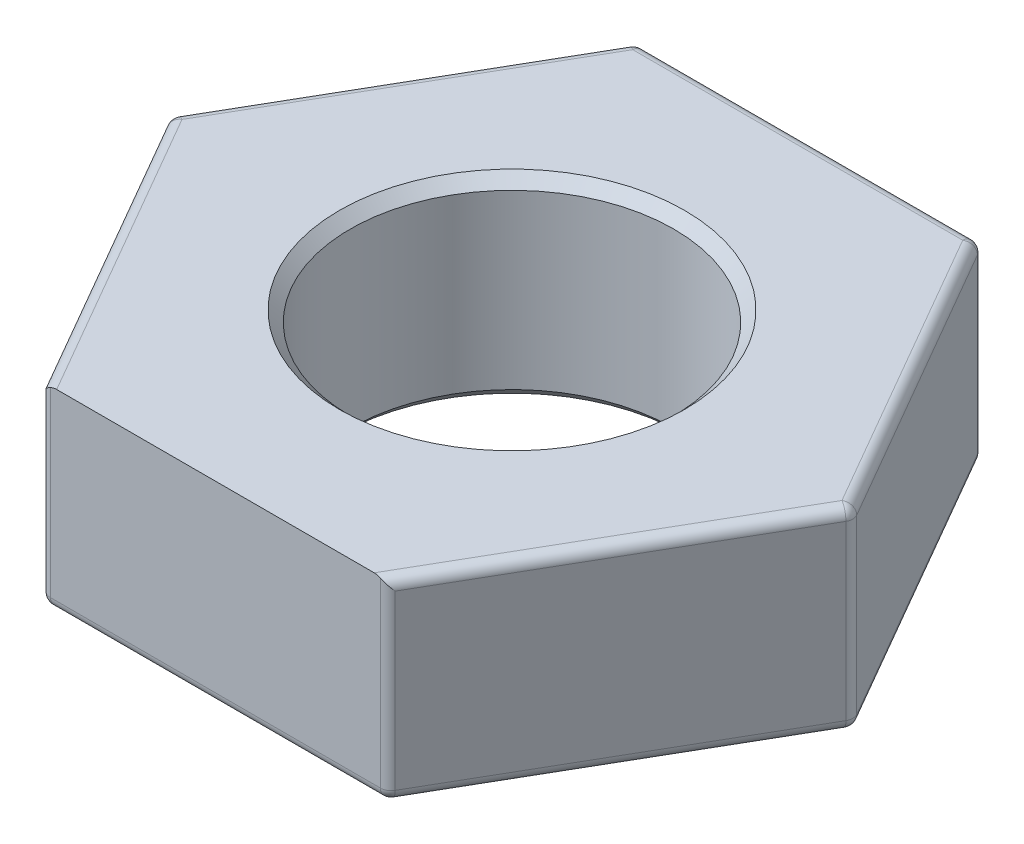
ISO-10303-21;
HEADER;
FILE_DESCRIPTION(('STEP AP214'),'2;1');
FILE_NAME('part.step','',(''),(''),'','','');
FILE_SCHEMA(('AUTOMOTIVE_DESIGN { 1 0 10303 214 1 1 1 1 }'));
ENDSEC;
DATA;
#1=APPLICATION_CONTEXT('core data for automotive mechanical design processes');
#2=APPLICATION_PROTOCOL_DEFINITION('international standard','automotive_design',2000,#1);
#3=PRODUCT_CONTEXT('',#1,'mechanical');
#4=PRODUCT('Part','Part','',(#3));
#5=PRODUCT_RELATED_PRODUCT_CATEGORY('part','',(#4));
#6=PRODUCT_DEFINITION_FORMATION('','',#4);
#7=PRODUCT_DEFINITION_CONTEXT('part definition',#1,'design');
#8=PRODUCT_DEFINITION('design','',#6,#7);
#9=PRODUCT_DEFINITION_SHAPE('','',#8);
#10=(LENGTH_UNIT() NAMED_UNIT(*) SI_UNIT(.MILLI.,.METRE.));
#11=(NAMED_UNIT(*) PLANE_ANGLE_UNIT() SI_UNIT($,.RADIAN.));
#12=(NAMED_UNIT(*) SI_UNIT($,.STERADIAN.) SOLID_ANGLE_UNIT());
#13=UNCERTAINTY_MEASURE_WITH_UNIT(LENGTH_MEASURE(1.E-05),#10,'distance_accuracy_value','');
#14=(GEOMETRIC_REPRESENTATION_CONTEXT(3) GLOBAL_UNCERTAINTY_ASSIGNED_CONTEXT((#13)) GLOBAL_UNIT_ASSIGNED_CONTEXT((#10,
#11,#12)) REPRESENTATION_CONTEXT('',''));
#15=CARTESIAN_POINT('',(0.,0.,0.));
#16=DIRECTION('',(0.,0.,1.));
#17=DIRECTION('',(1.,0.,0.));
#18=AXIS2_PLACEMENT_3D('',#15,#16,#17);
#19=CARTESIAN_POINT('',(-2.38156986040721,1.8,-1.375));
#20=DIRECTION('',(-0.866025403784438,0.,-0.5));
#21=DIRECTION('',(-0.5,0.,0.866025403784439));
#22=AXIS2_PLACEMENT_3D('',#19,#20,#21);
#23=PLANE('',#22);
#24=DIRECTION('',(0.,-1.,0.));
#25=VECTOR('',#24,1.);
#26=CARTESIAN_POINT('',(-1.61658075373095,1.8,-2.7));
#27=LINE('',#26,#25);
#28=CARTESIAN_POINT('',(-1.61658075373095,1.7,-2.7));
#29=VERTEX_POINT('',#28);
#30=CARTESIAN_POINT('',(-1.61658075373095,0.1,-2.7));
#31=VERTEX_POINT('',#30);
#32=EDGE_CURVE('E414',#29,#31,#27,.T.);
#33=ORIENTED_EDGE('',*,*,#32,.T.);
#34=DIRECTION('',(0.5,0.,-0.866025403784439));
#35=VECTOR('',#34,1.);
#36=CARTESIAN_POINT('',(-3.17542648054294,0.1,0.));
#37=LINE('',#36,#35);
#38=CARTESIAN_POINT('',(-3.14655896708346,0.1,-0.0500000000000005));
#39=VERTEX_POINT('',#38);
#40=EDGE_CURVE('E420',#31,#39,#37,.F.);
#41=ORIENTED_EDGE('',*,*,#40,.T.);
#42=DIRECTION('',(0.,-1.,0.));
#43=VECTOR('',#42,1.);
#44=CARTESIAN_POINT('',(-3.14655896708346,1.8,-0.0500000000000003));
#45=LINE('',#44,#43);
#46=CARTESIAN_POINT('',(-3.14655896708346,1.7,-0.0500000000000005));
#47=VERTEX_POINT('',#46);
#48=EDGE_CURVE('E417',#39,#47,#45,.F.);
#49=ORIENTED_EDGE('',*,*,#48,.T.);
#50=DIRECTION('',(0.5,0.,-0.866025403784439));
#51=VECTOR('',#50,1.);
#52=CARTESIAN_POINT('',(-2.38156986040721,1.7,-1.375));
#53=LINE('',#52,#51);
#54=EDGE_CURVE('E411',#47,#29,#53,.T.);
#55=ORIENTED_EDGE('',*,*,#54,.T.);
#56=EDGE_LOOP('',(#33,#41,#49,#55));
#57=FACE_BOUND('',#56,.T.);
#58=ADVANCED_FACE('F41',(#57),#23,.T.);
#59=CARTESIAN_POINT('',(-2.38156986040721,1.8,1.375));
#60=DIRECTION('',(-0.866025403784439,0.,0.499999999999999));
#61=DIRECTION('',(0.499999999999999,0.,0.866025403784439));
#62=AXIS2_PLACEMENT_3D('',#59,#60,#61);
#63=PLANE('',#62);
#64=DIRECTION('',(0.,-1.,0.));
#65=VECTOR('',#64,1.);
#66=CARTESIAN_POINT('',(-3.14655896708346,1.8,0.0499999999999995));
#67=LINE('',#66,#65);
#68=CARTESIAN_POINT('',(-3.14655896708346,1.7,0.0499999999999996));
#69=VERTEX_POINT('',#68);
#70=CARTESIAN_POINT('',(-3.14655896708346,0.1,0.0499999999999996));
#71=VERTEX_POINT('',#70);
#72=EDGE_CURVE('E427',#69,#71,#67,.T.);
#73=ORIENTED_EDGE('',*,*,#72,.T.);
#74=DIRECTION('',(-0.499999999999999,0.,-0.866025403784439));
#75=VECTOR('',#74,1.);
#76=CARTESIAN_POINT('',(-1.58771324027147,0.1,2.75));
#77=LINE('',#76,#75);
#78=CARTESIAN_POINT('',(-1.61658075373095,0.1,2.7));
#79=VERTEX_POINT('',#78);
#80=EDGE_CURVE('E433',#71,#79,#77,.F.);
#81=ORIENTED_EDGE('',*,*,#80,.T.);
#82=DIRECTION('',(0.,-1.,0.));
#83=VECTOR('',#82,1.);
#84=CARTESIAN_POINT('',(-1.61658075373095,1.8,2.7));
#85=LINE('',#84,#83);
#86=CARTESIAN_POINT('',(-1.61658075373095,1.7,2.7));
#87=VERTEX_POINT('',#86);
#88=EDGE_CURVE('E430',#79,#87,#85,.F.);
#89=ORIENTED_EDGE('',*,*,#88,.T.);
#90=DIRECTION('',(-0.499999999999999,0.,-0.866025403784439));
#91=VECTOR('',#90,1.);
#92=CARTESIAN_POINT('',(-2.38156986040721,1.7,1.375));
#93=LINE('',#92,#91);
#94=EDGE_CURVE('E424',#87,#69,#93,.T.);
#95=ORIENTED_EDGE('',*,*,#94,.T.);
#96=EDGE_LOOP('',(#73,#81,#89,#95));
#97=FACE_BOUND('',#96,.T.);
#98=ADVANCED_FACE('F542',(#97),#63,.T.);
#99=CARTESIAN_POINT('',(0.,1.8,2.75));
#100=DIRECTION('',(0.,0.,-1.));
#101=DIRECTION('',(-1.,0.,0.));
#102=AXIS2_PLACEMENT_3D('',#99,#100,#101);
#103=PLANE('',#102);
#104=DIRECTION('',(0.,-1.,0.));
#105=VECTOR('',#104,1.);
#106=CARTESIAN_POINT('',(1.52997821335251,1.8,2.75));
#107=LINE('',#106,#105);
#108=CARTESIAN_POINT('',(1.52997821335251,0.1,2.75));
#109=VERTEX_POINT('',#108);
#110=CARTESIAN_POINT('',(1.52997821335251,1.78660254037845,2.75));
#111=VERTEX_POINT('',#110);
#112=EDGE_CURVE('E447',#109,#111,#107,.F.);
#113=ORIENTED_EDGE('',*,*,#112,.T.);
#114=CARTESIAN_POINT('',(1.47224318643354,1.7,2.75));
#115=DIRECTION('',(0.,0.,-1.));
#116=DIRECTION('',(-1.,0.,0.));
#117=AXIS2_PLACEMENT_3D('',#114,#115,#116);
#118=ELLIPSE('',#117,0.115470053837925,0.1);
#119=CARTESIAN_POINT('',(1.47224318643354,1.8,2.75));
#120=VERTEX_POINT('',#119);
#121=EDGE_CURVE('E450',#111,#120,#118,.F.);
#122=ORIENTED_EDGE('',*,*,#121,.T.);
#123=DIRECTION('',(1.,0.,0.));
#124=VECTOR('',#123,1.);
#125=CARTESIAN_POINT('',(0.,1.8,2.75));
#126=LINE('',#125,#124);
#127=CARTESIAN_POINT('',(-1.47224318643355,1.8,2.75));
#128=VERTEX_POINT('',#127);
#129=EDGE_CURVE('E191',#128,#120,#126,.T.);
#130=ORIENTED_EDGE('',*,*,#129,.F.);
#131=CARTESIAN_POINT('',(-1.47224318643355,1.7,2.75));
#132=DIRECTION('',(0.,0.,-1.));
#133=DIRECTION('',(-1.,0.,0.));
#134=AXIS2_PLACEMENT_3D('',#131,#132,#133);
#135=ELLIPSE('',#134,0.115470053837925,0.1);
#136=CARTESIAN_POINT('',(-1.52997821335251,1.78660254037845,2.75));
#137=VERTEX_POINT('',#136);
#138=EDGE_CURVE('E437',#128,#137,#135,.F.);
#139=ORIENTED_EDGE('',*,*,#138,.T.);
#140=DIRECTION('',(0.,-1.,0.));
#141=VECTOR('',#140,1.);
#142=CARTESIAN_POINT('',(-1.52997821335251,0.,2.75));
#143=LINE('',#142,#141);
#144=CARTESIAN_POINT('',(-1.52997821335251,0.1,2.75));
#145=VERTEX_POINT('',#144);
#146=EDGE_CURVE('E440',#137,#145,#143,.T.);
#147=ORIENTED_EDGE('',*,*,#146,.T.);
#148=DIRECTION('',(1.,0.,0.));
#149=VECTOR('',#148,1.);
#150=CARTESIAN_POINT('',(0.,0.1,2.75));
#151=LINE('',#150,#149);
#152=EDGE_CURVE('E443',#145,#109,#151,.T.);
#153=ORIENTED_EDGE('',*,*,#152,.T.);
#154=EDGE_LOOP('',(#113,#122,#130,#139,#147,#153));
#155=FACE_BOUND('',#154,.T.);
#156=ADVANCED_FACE('F502',(#155),#103,.F.);
#157=CARTESIAN_POINT('',(2.38156986040721,1.8,1.375));
#158=DIRECTION('',(-0.866025403784439,0.,-0.5));
#159=DIRECTION('',(-0.5,0.,0.866025403784439));
#160=AXIS2_PLACEMENT_3D('',#157,#158,#159);
#161=PLANE('',#160);
#162=DIRECTION('',(0.,-1.,0.));
#163=VECTOR('',#162,1.);
#164=CARTESIAN_POINT('',(1.61658075373095,1.8,2.7));
#165=LINE('',#164,#163);
#166=CARTESIAN_POINT('',(1.61658075373095,1.7,2.7));
#167=VERTEX_POINT('',#166);
#168=CARTESIAN_POINT('',(1.61658075373095,0.1,2.7));
#169=VERTEX_POINT('',#168);
#170=EDGE_CURVE('E459',#167,#169,#165,.T.);
#171=ORIENTED_EDGE('',*,*,#170,.T.);
#172=DIRECTION('',(0.5,0.,-0.866025403784439));
#173=VECTOR('',#172,1.);
#174=CARTESIAN_POINT('',(2.38156986040721,0.1,1.375));
#175=LINE('',#174,#173);
#176=CARTESIAN_POINT('',(3.14655896708346,0.1,0.050000000000001));
#177=VERTEX_POINT('',#176);
#178=EDGE_CURVE('E462',#169,#177,#175,.T.);
#179=ORIENTED_EDGE('',*,*,#178,.T.);
#180=DIRECTION('',(0.,-1.,0.));
#181=VECTOR('',#180,1.);
#182=CARTESIAN_POINT('',(3.14655896708346,1.8,0.050000000000001));
#183=LINE('',#182,#181);
#184=CARTESIAN_POINT('',(3.14655896708346,1.7,0.050000000000001));
#185=VERTEX_POINT('',#184);
#186=EDGE_CURVE('E456',#177,#185,#183,.F.);
#187=ORIENTED_EDGE('',*,*,#186,.T.);
#188=DIRECTION('',(0.5,0.,-0.866025403784439));
#189=VECTOR('',#188,1.);
#190=CARTESIAN_POINT('',(1.58771324027147,1.7,2.75));
#191=LINE('',#190,#189);
#192=EDGE_CURVE('E453',#185,#167,#191,.F.);
#193=ORIENTED_EDGE('',*,*,#192,.T.);
#194=EDGE_LOOP('',(#171,#179,#187,#193));
#195=FACE_BOUND('',#194,.T.);
#196=ADVANCED_FACE('F513',(#195),#161,.F.);
#197=CARTESIAN_POINT('',(2.38156986040721,1.8,-1.375));
#198=DIRECTION('',(-0.866025403784439,0.,0.5));
#199=DIRECTION('',(0.5,0.,0.866025403784439));
#200=AXIS2_PLACEMENT_3D('',#197,#198,#199);
#201=PLANE('',#200);
#202=DIRECTION('',(0.,-1.,0.));
#203=VECTOR('',#202,1.);
#204=CARTESIAN_POINT('',(3.14655896708346,1.8,-0.0499999999999988));
#205=LINE('',#204,#203);
#206=CARTESIAN_POINT('',(3.14655896708346,1.7,-0.0499999999999988));
#207=VERTEX_POINT('',#206);
#208=CARTESIAN_POINT('',(3.14655896708346,0.1,-0.0499999999999988));
#209=VERTEX_POINT('',#208);
#210=EDGE_CURVE('E179',#207,#209,#205,.T.);
#211=ORIENTED_EDGE('',*,*,#210,.T.);
#212=DIRECTION('',(-0.5,0.,-0.866025403784439));
#213=VECTOR('',#212,1.);
#214=CARTESIAN_POINT('',(2.38156986040721,0.1,-1.375));
#215=LINE('',#214,#213);
#216=CARTESIAN_POINT('',(1.61658075373095,0.1,-2.7));
#217=VERTEX_POINT('',#216);
#218=EDGE_CURVE('E174',#209,#217,#215,.T.);
#219=ORIENTED_EDGE('',*,*,#218,.T.);
#220=DIRECTION('',(0.,-1.,0.));
#221=VECTOR('',#220,1.);
#222=CARTESIAN_POINT('',(1.61658075373095,1.8,-2.7));
#223=LINE('',#222,#221);
#224=CARTESIAN_POINT('',(1.61658075373095,1.7,-2.7));
#225=VERTEX_POINT('',#224);
#226=EDGE_CURVE('E168',#217,#225,#223,.F.);
#227=ORIENTED_EDGE('',*,*,#226,.T.);
#228=DIRECTION('',(-0.5,0.,-0.866025403784439));
#229=VECTOR('',#228,1.);
#230=CARTESIAN_POINT('',(3.17542648054294,1.7,0.));
#231=LINE('',#230,#229);
#232=EDGE_CURVE('E171',#225,#207,#231,.F.);
#233=ORIENTED_EDGE('',*,*,#232,.T.);
#234=EDGE_LOOP('',(#211,#219,#227,#233));
#235=FACE_BOUND('',#234,.T.);
#236=ADVANCED_FACE('F170',(#235),#201,.F.);
#237=CARTESIAN_POINT('',(0.,1.8,-2.75));
#238=DIRECTION('',(0.,0.,-1.));
#239=DIRECTION('',(-1.,0.,0.));
#240=AXIS2_PLACEMENT_3D('',#237,#238,#239);
#241=PLANE('',#240);
#242=DIRECTION('',(0.,-1.,0.));
#243=VECTOR('',#242,1.);
#244=CARTESIAN_POINT('',(1.52997821335251,0.,-2.75));
#245=LINE('',#244,#243);
#246=CARTESIAN_POINT('',(1.52997821335251,1.7,-2.75));
#247=VERTEX_POINT('',#246);
#248=CARTESIAN_POINT('',(1.52997821335251,0.1,-2.75));
#249=VERTEX_POINT('',#248);
#250=EDGE_CURVE('E203',#247,#249,#245,.T.);
#251=ORIENTED_EDGE('',*,*,#250,.T.);
#252=DIRECTION('',(1.,0.,0.));
#253=VECTOR('',#252,1.);
#254=CARTESIAN_POINT('',(-1.58771324027147,0.1,-2.75));
#255=LINE('',#254,#253);
#256=CARTESIAN_POINT('',(-1.52997821335251,0.1,-2.75));
#257=VERTEX_POINT('',#256);
#258=EDGE_CURVE('E349',#249,#257,#255,.F.);
#259=ORIENTED_EDGE('',*,*,#258,.T.);
#260=DIRECTION('',(0.,-1.,0.));
#261=VECTOR('',#260,1.);
#262=CARTESIAN_POINT('',(-1.52997821335251,1.8,-2.75));
#263=LINE('',#262,#261);
#264=CARTESIAN_POINT('',(-1.52997821335251,1.7,-2.75));
#265=VERTEX_POINT('',#264);
#266=EDGE_CURVE('E406',#257,#265,#263,.F.);
#267=ORIENTED_EDGE('',*,*,#266,.T.);
#268=DIRECTION('',(1.,0.,0.));
#269=VECTOR('',#268,1.);
#270=CARTESIAN_POINT('',(0.,1.7,-2.75));
#271=LINE('',#270,#269);
#272=EDGE_CURVE('E362',#265,#247,#271,.T.);
#273=ORIENTED_EDGE('',*,*,#272,.T.);
#274=EDGE_LOOP('',(#251,#259,#267,#273));
#275=FACE_BOUND('',#274,.T.);
#276=ADVANCED_FACE('F319',(#275),#241,.T.);
#277=CARTESIAN_POINT('',(0.,1.8,0.));
#278=DIRECTION('',(0.,-1.,0.));
#279=DIRECTION('',(0.,0.,-1.));
#280=AXIS2_PLACEMENT_3D('',#277,#278,#279);
#281=CYLINDRICAL_SURFACE('',#280,1.5);
#282=CARTESIAN_POINT('',(0.,1.7,0.));
#283=DIRECTION('',(0.,1.,0.));
#284=DIRECTION('',(0.,0.,1.));
#285=AXIS2_PLACEMENT_3D('',#282,#283,#284);
#286=CIRCLE('',#285,1.5);
#287=CARTESIAN_POINT('',(0.,1.7,1.5));
#288=VERTEX_POINT('',#287);
#289=EDGE_CURVE('E301',#288,#288,#286,.T.);
#290=ORIENTED_EDGE('',*,*,#289,.T.);
#291=EDGE_LOOP('',(#290));
#292=FACE_BOUND('',#291,.T.);
#293=CARTESIAN_POINT('',(0.,0.0999999999999998,0.));
#294=DIRECTION('',(0.,1.,0.));
#295=DIRECTION('',(0.,0.,1.));
#296=AXIS2_PLACEMENT_3D('',#293,#294,#295);
#297=CIRCLE('',#296,1.5);
#298=CARTESIAN_POINT('',(0.,0.0999999999999998,-1.5));
#299=VERTEX_POINT('',#298);
#300=EDGE_CURVE('E297',#299,#299,#297,.F.);
#301=ORIENTED_EDGE('',*,*,#300,.T.);
#302=EDGE_LOOP('',(#301));
#303=FACE_BOUND('',#302,.T.);
#304=ADVANCED_FACE('F316',(#292,#303),#281,.F.);
#305=CARTESIAN_POINT('',(0.,1.8,0.));
#306=DIRECTION('',(0.,1.,0.));
#307=DIRECTION('',(0.,0.,1.));
#308=AXIS2_PLACEMENT_3D('',#305,#306,#307);
#309=PLANE('',#308);
#310=CARTESIAN_POINT('',(0.,1.8,0.));
#311=DIRECTION('',(0.,1.,0.));
#312=DIRECTION('',(0.,0.,1.));
#313=AXIS2_PLACEMENT_3D('',#310,#311,#312);
#314=CIRCLE('',#313,1.6);
#315=CARTESIAN_POINT('',(0.,1.8,1.6));
#316=VERTEX_POINT('',#315);
#317=EDGE_CURVE('E51',#316,#316,#314,.F.);
#318=ORIENTED_EDGE('',*,*,#317,.T.);
#319=EDGE_LOOP('',(#318));
#320=FACE_BOUND('',#319,.T.);
#321=ORIENTED_EDGE('',*,*,#129,.T.);
#322=DIRECTION('',(0.5,0.,-0.866025403784439));
#323=VECTOR('',#322,1.);
#324=CARTESIAN_POINT('',(3.0888239401645,1.8,-0.0499999999999997));
#325=LINE('',#324,#323);
#326=CARTESIAN_POINT('',(3.05995642670502,1.8,0.));
#327=VERTEX_POINT('',#326);
#328=EDGE_CURVE('E58',#120,#327,#325,.T.);
#329=ORIENTED_EDGE('',*,*,#328,.T.);
#330=DIRECTION('',(-0.5,0.,-0.866025403784439));
#331=VECTOR('',#330,1.);
#332=CARTESIAN_POINT('',(1.50111069989303,1.8,-2.7));
#333=LINE('',#332,#331);
#334=CARTESIAN_POINT('',(1.52997821335251,1.8,-2.65));
#335=VERTEX_POINT('',#334);
#336=EDGE_CURVE('E473',#327,#335,#333,.T.);
#337=ORIENTED_EDGE('',*,*,#336,.T.);
#338=DIRECTION('',(1.,0.,0.));
#339=VECTOR('',#338,1.);
#340=CARTESIAN_POINT('',(0.,1.8,-2.65));
#341=LINE('',#340,#339);
#342=CARTESIAN_POINT('',(-1.52997821335251,1.8,-2.65));
#343=VERTEX_POINT('',#342);
#344=EDGE_CURVE('E466',#335,#343,#341,.F.);
#345=ORIENTED_EDGE('',*,*,#344,.T.);
#346=DIRECTION('',(0.5,0.,-0.866025403784439));
#347=VECTOR('',#346,1.);
#348=CARTESIAN_POINT('',(-2.29496732002876,1.8,-1.325));
#349=LINE('',#348,#347);
#350=CARTESIAN_POINT('',(-3.05995642670502,1.8,0.));
#351=VERTEX_POINT('',#350);
#352=EDGE_CURVE('E65',#343,#351,#349,.F.);
#353=ORIENTED_EDGE('',*,*,#352,.T.);
#354=DIRECTION('',(-0.499999999999999,0.,-0.866025403784439));
#355=VECTOR('',#354,1.);
#356=CARTESIAN_POINT('',(-2.29496732002876,1.8,1.325));
#357=LINE('',#356,#355);
#358=EDGE_CURVE('E471',#351,#128,#357,.F.);
#359=ORIENTED_EDGE('',*,*,#358,.T.);
#360=EDGE_LOOP('',(#321,#329,#337,#345,#353,#359));
#361=FACE_BOUND('',#360,.T.);
#362=ADVANCED_FACE('F308',(#320,#361),#309,.T.);
#363=CARTESIAN_POINT('',(0.,0.,0.));
#364=DIRECTION('',(0.,1.,0.));
#365=DIRECTION('',(0.,0.,1.));
#366=AXIS2_PLACEMENT_3D('',#363,#364,#365);
#367=PLANE('',#366);
#368=CARTESIAN_POINT('',(0.,0.,0.));
#369=DIRECTION('',(0.,1.,0.));
#370=DIRECTION('',(0.,0.,1.));
#371=AXIS2_PLACEMENT_3D('',#368,#369,#370);
#372=CIRCLE('',#371,1.6);
#373=CARTESIAN_POINT('',(0.,0.,-1.6));
#374=VERTEX_POINT('',#373);
#375=EDGE_CURVE('E11',#374,#374,#372,.T.);
#376=ORIENTED_EDGE('',*,*,#375,.T.);
#377=EDGE_LOOP('',(#376));
#378=FACE_BOUND('',#377,.T.);
#379=DIRECTION('',(1.,0.,0.));
#380=VECTOR('',#379,1.);
#381=CARTESIAN_POINT('',(1.58771324027147,0.,-2.65));
#382=LINE('',#381,#380);
#383=CARTESIAN_POINT('',(-1.52997821335251,0.,-2.65));
#384=VERTEX_POINT('',#383);
#385=CARTESIAN_POINT('',(1.52997821335251,0.,-2.65));
#386=VERTEX_POINT('',#385);
#387=EDGE_CURVE('E334',#384,#386,#382,.T.);
#388=ORIENTED_EDGE('',*,*,#387,.T.);
#389=DIRECTION('',(-0.5,0.,-0.866025403784439));
#390=VECTOR('',#389,1.);
#391=CARTESIAN_POINT('',(2.29496732002876,0.,-1.325));
#392=LINE('',#391,#390);
#393=CARTESIAN_POINT('',(3.05995642670502,0.,0.));
#394=VERTEX_POINT('',#393);
#395=EDGE_CURVE('E337',#386,#394,#392,.F.);
#396=ORIENTED_EDGE('',*,*,#395,.T.);
#397=DIRECTION('',(0.5,0.,-0.866025403784439));
#398=VECTOR('',#397,1.);
#399=CARTESIAN_POINT('',(2.29496732002876,0.,1.325));
#400=LINE('',#399,#398);
#401=CARTESIAN_POINT('',(1.52997821335251,0.,2.65));
#402=VERTEX_POINT('',#401);
#403=EDGE_CURVE('E385',#394,#402,#400,.F.);
#404=ORIENTED_EDGE('',*,*,#403,.T.);
#405=DIRECTION('',(1.,0.,0.));
#406=VECTOR('',#405,1.);
#407=CARTESIAN_POINT('',(0.,0.,2.65));
#408=LINE('',#407,#406);
#409=CARTESIAN_POINT('',(-1.52997821335251,0.,2.65));
#410=VERTEX_POINT('',#409);
#411=EDGE_CURVE('E390',#402,#410,#408,.F.);
#412=ORIENTED_EDGE('',*,*,#411,.T.);
#413=DIRECTION('',(-0.499999999999999,0.,-0.866025403784439));
#414=VECTOR('',#413,1.);
#415=CARTESIAN_POINT('',(-3.0888239401645,0.,-0.0500000000000003));
#416=LINE('',#415,#414);
#417=CARTESIAN_POINT('',(-3.05995642670502,0.,0.));
#418=VERTEX_POINT('',#417);
#419=EDGE_CURVE('E394',#410,#418,#416,.T.);
#420=ORIENTED_EDGE('',*,*,#419,.T.);
#421=DIRECTION('',(0.5,0.,-0.866025403784439));
#422=VECTOR('',#421,1.);
#423=CARTESIAN_POINT('',(-1.50111069989303,0.,-2.7));
#424=LINE('',#423,#422);
#425=EDGE_CURVE('E339',#418,#384,#424,.T.);
#426=ORIENTED_EDGE('',*,*,#425,.T.);
#427=EDGE_LOOP('',(#388,#396,#404,#412,#420,#426));
#428=FACE_BOUND('',#427,.T.);
#429=ADVANCED_FACE('F327',(#378,#428),#367,.F.);
#430=CARTESIAN_POINT('',(-2.29496732002876,1.7,1.325));
#431=DIRECTION('',(-0.499999999999999,0.,-0.866025403784439));
#432=DIRECTION('',(-0.866025403784439,0.,0.499999999999999));
#433=AXIS2_PLACEMENT_3D('',#430,#431,#432);
#434=CYLINDRICAL_SURFACE('',#433,0.1);
#435=CARTESIAN_POINT('',(-3.05995642670502,1.7,0.));
#436=DIRECTION('',(-0.499999999999999,0.,-0.866025403784439));
#437=DIRECTION('',(-0.866025403784439,0.,0.499999999999999));
#438=AXIS2_PLACEMENT_3D('',#435,#436,#437);
#439=CIRCLE('',#438,0.1);
#440=EDGE_CURVE('E293',#69,#351,#439,.T.);
#441=ORIENTED_EDGE('',*,*,#440,.F.);
#442=ORIENTED_EDGE('',*,*,#94,.F.);
#443=CARTESIAN_POINT('',(-1.52997821335251,1.7,2.65));
#444=DIRECTION('',(-0.353553390593273,0.707106781186547,-0.612372435695795));
#445=DIRECTION('',(-0.353553390593273,-0.707106781186547,-0.612372435695795));
#446=AXIS2_PLACEMENT_3D('',#443,#444,#445);
#447=ELLIPSE('',#446,0.14142135623731,0.1);
#448=EDGE_CURVE('E289',#137,#87,#447,.F.);
#449=ORIENTED_EDGE('',*,*,#448,.F.);
#450=ORIENTED_EDGE('',*,*,#138,.F.);
#451=ORIENTED_EDGE('',*,*,#358,.F.);
#452=EDGE_LOOP('',(#441,#442,#449,#450,#451));
#453=FACE_BOUND('',#452,.T.);
#454=ADVANCED_FACE('F330',(#453),#434,.T.);
#455=CARTESIAN_POINT('',(-3.05995642670502,1.7,0.));
#456=DIRECTION('',(0.,1.,0.));
#457=DIRECTION('',(0.,0.,1.));
#458=AXIS2_PLACEMENT_3D('',#455,#456,#457);
#459=SPHERICAL_SURFACE('',#458,0.1);
#460=CARTESIAN_POINT('',(-3.05995642670502,1.7,0.));
#461=DIRECTION('',(0.,1.,0.));
#462=DIRECTION('',(0.,0.,1.));
#463=AXIS2_PLACEMENT_3D('',#460,#461,#462);
#464=CIRCLE('',#463,0.1);
#465=EDGE_CURVE('E281',#69,#47,#464,.F.);
#466=ORIENTED_EDGE('',*,*,#465,.F.);
#467=ORIENTED_EDGE('',*,*,#440,.T.);
#468=CARTESIAN_POINT('',(-3.05995642670502,1.7,0.));
#469=DIRECTION('',(-0.5,0.,0.866025403784439));
#470=DIRECTION('',(0.866025403784439,0.,0.5));
#471=AXIS2_PLACEMENT_3D('',#468,#469,#470);
#472=CIRCLE('',#471,0.1);
#473=EDGE_CURVE('E285',#47,#351,#472,.F.);
#474=ORIENTED_EDGE('',*,*,#473,.F.);
#475=EDGE_LOOP('',(#466,#467,#474));
#476=FACE_BOUND('',#475,.T.);
#477=ADVANCED_FACE('F493',(#476),#459,.T.);
#478=CARTESIAN_POINT('',(-1.52997821335251,1.8,2.65));
#479=DIRECTION('',(0.,1.,0.));
#480=DIRECTION('',(0.,0.,1.));
#481=AXIS2_PLACEMENT_3D('',#478,#479,#480);
#482=CYLINDRICAL_SURFACE('',#481,0.1);
#483=ORIENTED_EDGE('',*,*,#448,.T.);
#484=ORIENTED_EDGE('',*,*,#88,.F.);
#485=CARTESIAN_POINT('',(-1.52997821335251,0.1,2.65));
#486=DIRECTION('',(0.,-1.,0.));
#487=DIRECTION('',(1.,0.,0.));
#488=AXIS2_PLACEMENT_3D('',#485,#486,#487);
#489=CIRCLE('',#488,0.1);
#490=EDGE_CURVE('E274',#145,#79,#489,.T.);
#491=ORIENTED_EDGE('',*,*,#490,.F.);
#492=ORIENTED_EDGE('',*,*,#146,.F.);
#493=EDGE_LOOP('',(#483,#484,#491,#492));
#494=FACE_BOUND('',#493,.T.);
#495=ADVANCED_FACE('F540',(#494),#482,.T.);
#496=CARTESIAN_POINT('',(-2.29496732002876,1.7,-1.325));
#497=DIRECTION('',(0.5,0.,-0.866025403784439));
#498=DIRECTION('',(-0.866025403784438,0.,-0.5));
#499=AXIS2_PLACEMENT_3D('',#496,#497,#498);
#500=CYLINDRICAL_SURFACE('',#499,0.1);
#501=ORIENTED_EDGE('',*,*,#473,.T.);
#502=ORIENTED_EDGE('',*,*,#352,.F.);
#503=CARTESIAN_POINT('',(-1.52997821335251,1.7,-2.65));
#504=DIRECTION('',(0.500000000000001,0.,-0.866025403784438));
#505=DIRECTION('',(-0.866025403784438,0.,-0.500000000000001));
#506=AXIS2_PLACEMENT_3D('',#503,#504,#505);
#507=CIRCLE('',#506,0.1);
#508=EDGE_CURVE('E270',#29,#343,#507,.T.);
#509=ORIENTED_EDGE('',*,*,#508,.F.);
#510=ORIENTED_EDGE('',*,*,#54,.F.);
#511=EDGE_LOOP('',(#501,#502,#509,#510));
#512=FACE_BOUND('',#511,.T.);
#513=ADVANCED_FACE('F489',(#512),#500,.T.);
#514=CARTESIAN_POINT('',(-3.05995642670502,1.8,0.));
#515=DIRECTION('',(0.,-1.,0.));
#516=DIRECTION('',(0.,0.,-1.));
#517=AXIS2_PLACEMENT_3D('',#514,#515,#516);
#518=CYLINDRICAL_SURFACE('',#517,0.1);
#519=ORIENTED_EDGE('',*,*,#465,.T.);
#520=ORIENTED_EDGE('',*,*,#48,.F.);
#521=CARTESIAN_POINT('',(-3.05995642670502,0.1,0.));
#522=DIRECTION('',(0.,-1.,0.));
#523=DIRECTION('',(0.,0.,-1.));
#524=AXIS2_PLACEMENT_3D('',#521,#522,#523);
#525=CIRCLE('',#524,0.1);
#526=EDGE_CURVE('E266',#71,#39,#525,.T.);
#527=ORIENTED_EDGE('',*,*,#526,.F.);
#528=ORIENTED_EDGE('',*,*,#72,.F.);
#529=EDGE_LOOP('',(#519,#520,#527,#528));
#530=FACE_BOUND('',#529,.T.);
#531=ADVANCED_FACE('F546',(#530),#518,.T.);
#532=CARTESIAN_POINT('',(-2.29496732002876,0.1,1.325));
#533=DIRECTION('',(0.499999999999999,0.,0.866025403784439));
#534=DIRECTION('',(0.866025403784439,0.,-0.499999999999999));
#535=AXIS2_PLACEMENT_3D('',#532,#533,#534);
#536=CYLINDRICAL_SURFACE('',#535,0.1);
#537=CARTESIAN_POINT('',(-1.52997821335251,0.1,2.65));
#538=DIRECTION('',(0.500000000000001,0.,0.866025403784438));
#539=DIRECTION('',(0.866025403784438,0.,-0.500000000000001));
#540=AXIS2_PLACEMENT_3D('',#537,#538,#539);
#541=CIRCLE('',#540,0.1);
#542=EDGE_CURVE('E277',#79,#410,#541,.T.);
#543=ORIENTED_EDGE('',*,*,#542,.F.);
#544=ORIENTED_EDGE('',*,*,#80,.F.);
#545=CARTESIAN_POINT('',(-3.05995642670502,0.1,0.));
#546=DIRECTION('',(-0.500000000000006,0.,-0.866025403784435));
#547=DIRECTION('',(-0.866025403784435,0.,0.500000000000006));
#548=AXIS2_PLACEMENT_3D('',#545,#546,#547);
#549=CIRCLE('',#548,0.1);
#550=EDGE_CURVE('E262',#418,#71,#549,.T.);
#551=ORIENTED_EDGE('',*,*,#550,.F.);
#552=ORIENTED_EDGE('',*,*,#419,.F.);
#553=EDGE_LOOP('',(#543,#544,#551,#552));
#554=FACE_BOUND('',#553,.T.);
#555=ADVANCED_FACE('F531',(#554),#536,.T.);
#556=CARTESIAN_POINT('',(-1.52997821335251,0.1,2.65));
#557=DIRECTION('',(0.,-1.,0.));
#558=DIRECTION('',(0.,0.,-1.));
#559=AXIS2_PLACEMENT_3D('',#556,#557,#558);
#560=SPHERICAL_SURFACE('',#559,0.1);
#561=ORIENTED_EDGE('',*,*,#490,.T.);
#562=ORIENTED_EDGE('',*,*,#542,.T.);
#563=CARTESIAN_POINT('',(-1.52997821335251,0.1,2.65));
#564=DIRECTION('',(-1.,0.,0.));
#565=DIRECTION('',(0.,0.,1.));
#566=AXIS2_PLACEMENT_3D('',#563,#564,#565);
#567=CIRCLE('',#566,0.1);
#568=EDGE_CURVE('E258',#145,#410,#567,.F.);
#569=ORIENTED_EDGE('',*,*,#568,.F.);
#570=EDGE_LOOP('',(#561,#562,#569));
#571=FACE_BOUND('',#570,.T.);
#572=ADVANCED_FACE('F536',(#571),#560,.T.);
#573=CARTESIAN_POINT('',(-1.52997821335251,1.7,-2.65));
#574=DIRECTION('',(0.,1.,0.));
#575=DIRECTION('',(-1.,0.,0.));
#576=AXIS2_PLACEMENT_3D('',#573,#574,#575);
#577=SPHERICAL_SURFACE('',#576,0.1);
#578=CARTESIAN_POINT('',(-1.52997821335251,1.7,-2.65));
#579=DIRECTION('',(0.,1.,0.));
#580=DIRECTION('',(0.,0.,1.));
#581=AXIS2_PLACEMENT_3D('',#578,#579,#580);
#582=CIRCLE('',#581,0.1);
#583=EDGE_CURVE('E246',#29,#265,#582,.F.);
#584=ORIENTED_EDGE('',*,*,#583,.F.);
#585=ORIENTED_EDGE('',*,*,#508,.T.);
#586=CARTESIAN_POINT('',(-1.52997821335251,1.7,-2.65));
#587=DIRECTION('',(-1.,0.,0.));
#588=DIRECTION('',(0.,0.,1.));
#589=AXIS2_PLACEMENT_3D('',#586,#587,#588);
#590=CIRCLE('',#589,0.1);
#591=EDGE_CURVE('E250',#265,#343,#590,.F.);
#592=ORIENTED_EDGE('',*,*,#591,.F.);
#593=EDGE_LOOP('',(#584,#585,#592));
#594=FACE_BOUND('',#593,.T.);
#595=ADVANCED_FACE('F484',(#594),#577,.T.);
#596=CARTESIAN_POINT('',(-3.05995642670502,0.1,0.));
#597=DIRECTION('',(0.,-1.,0.));
#598=DIRECTION('',(0.,0.,-1.));
#599=AXIS2_PLACEMENT_3D('',#596,#597,#598);
#600=SPHERICAL_SURFACE('',#599,0.1);
#601=ORIENTED_EDGE('',*,*,#550,.T.);
#602=ORIENTED_EDGE('',*,*,#526,.T.);
#603=CARTESIAN_POINT('',(-3.05995642670502,0.1,0.));
#604=DIRECTION('',(-0.500000000000001,0.,0.866025403784438));
#605=DIRECTION('',(0.866025403784438,0.,0.500000000000001));
#606=AXIS2_PLACEMENT_3D('',#603,#604,#605);
#607=CIRCLE('',#606,0.1);
#608=EDGE_CURVE('E243',#418,#39,#607,.F.);
#609=ORIENTED_EDGE('',*,*,#608,.F.);
#610=EDGE_LOOP('',(#601,#602,#609));
#611=FACE_BOUND('',#610,.T.);
#612=ADVANCED_FACE('F548',(#611),#600,.T.);
#613=CARTESIAN_POINT('',(0.,0.1,2.65));
#614=DIRECTION('',(1.,0.,0.));
#615=DIRECTION('',(0.,0.,-1.));
#616=AXIS2_PLACEMENT_3D('',#613,#614,#615);
#617=CYLINDRICAL_SURFACE('',#616,0.1);
#618=ORIENTED_EDGE('',*,*,#568,.T.);
#619=ORIENTED_EDGE('',*,*,#411,.F.);
#620=CARTESIAN_POINT('',(1.52997821335251,0.1,2.65));
#621=DIRECTION('',(1.,0.,0.));
#622=DIRECTION('',(0.,1.,0.));
#623=AXIS2_PLACEMENT_3D('',#620,#621,#622);
#624=CIRCLE('',#623,0.1);
#625=EDGE_CURVE('E239',#109,#402,#624,.T.);
#626=ORIENTED_EDGE('',*,*,#625,.F.);
#627=ORIENTED_EDGE('',*,*,#152,.F.);
#628=EDGE_LOOP('',(#618,#619,#626,#627));
#629=FACE_BOUND('',#628,.T.);
#630=ADVANCED_FACE('F525',(#629),#617,.T.);
#631=CARTESIAN_POINT('',(1.52997821335251,1.8,2.65));
#632=DIRECTION('',(0.,-1.,0.));
#633=DIRECTION('',(0.,0.,-1.));
#634=AXIS2_PLACEMENT_3D('',#631,#632,#633);
#635=CYLINDRICAL_SURFACE('',#634,0.1);
#636=CARTESIAN_POINT('',(1.52997821335251,0.1,2.65));
#637=DIRECTION('',(0.,-1.,0.));
#638=DIRECTION('',(0.,0.,-1.));
#639=AXIS2_PLACEMENT_3D('',#636,#637,#638);
#640=CIRCLE('',#639,0.1);
#641=EDGE_CURVE('E236',#169,#109,#640,.T.);
#642=ORIENTED_EDGE('',*,*,#641,.F.);
#643=ORIENTED_EDGE('',*,*,#170,.F.);
#644=CARTESIAN_POINT('',(1.52997821335251,1.7,2.65));
#645=DIRECTION('',(-0.353553390593274,-0.707106781186547,0.612372435695795));
#646=DIRECTION('',(-0.353553390593274,0.707106781186547,0.612372435695795));
#647=AXIS2_PLACEMENT_3D('',#644,#645,#646);
#648=ELLIPSE('',#647,0.14142135623731,0.1);
#649=EDGE_CURVE('E254',#111,#167,#648,.F.);
#650=ORIENTED_EDGE('',*,*,#649,.F.);
#651=ORIENTED_EDGE('',*,*,#112,.F.);
#652=EDGE_LOOP('',(#642,#643,#650,#651));
#653=FACE_BOUND('',#652,.T.);
#654=ADVANCED_FACE('F519',(#653),#635,.T.);
#655=CARTESIAN_POINT('',(2.29496732002876,1.7,1.325));
#656=DIRECTION('',(-0.5,0.,0.866025403784439));
#657=DIRECTION('',(0.866025403784439,0.,0.5));
#658=AXIS2_PLACEMENT_3D('',#655,#656,#657);
#659=CYLINDRICAL_SURFACE('',#658,0.1);
#660=ORIENTED_EDGE('',*,*,#649,.T.);
#661=ORIENTED_EDGE('',*,*,#192,.F.);
#662=CARTESIAN_POINT('',(3.05995642670502,1.7,0.));
#663=DIRECTION('',(0.499999999999999,0.,-0.866025403784439));
#664=DIRECTION('',(-0.866025403784439,0.,-0.499999999999999));
#665=AXIS2_PLACEMENT_3D('',#662,#663,#664);
#666=CIRCLE('',#665,0.1);
#667=EDGE_CURVE('E232',#327,#185,#666,.T.);
#668=ORIENTED_EDGE('',*,*,#667,.F.);
#669=ORIENTED_EDGE('',*,*,#328,.F.);
#670=ORIENTED_EDGE('',*,*,#121,.F.);
#671=EDGE_LOOP('',(#660,#661,#668,#669,#670));
#672=FACE_BOUND('',#671,.T.);
#673=ADVANCED_FACE('F607',(#672),#659,.T.);
#674=CARTESIAN_POINT('',(2.29496732002876,1.7,-1.325));
#675=DIRECTION('',(0.5,0.,0.866025403784439));
#676=DIRECTION('',(0.866025403784439,0.,-0.5));
#677=AXIS2_PLACEMENT_3D('',#674,#675,#676);
#678=CYLINDRICAL_SURFACE('',#677,0.1);
#679=CARTESIAN_POINT('',(1.52997821335251,1.7,-2.65));
#680=DIRECTION('',(-0.499999999999998,0.,-0.86602540378444));
#681=DIRECTION('',(-0.86602540378444,0.,0.499999999999998));
#682=AXIS2_PLACEMENT_3D('',#679,#680,#681);
#683=CIRCLE('',#682,0.1);
#684=EDGE_CURVE('E185',#335,#225,#683,.T.);
#685=ORIENTED_EDGE('',*,*,#684,.F.);
#686=ORIENTED_EDGE('',*,*,#336,.F.);
#687=CARTESIAN_POINT('',(3.05995642670502,1.7,0.));
#688=DIRECTION('',(0.500000000000001,0.,0.866025403784438));
#689=DIRECTION('',(0.866025403784438,0.,-0.500000000000001));
#690=AXIS2_PLACEMENT_3D('',#687,#688,#689);
#691=CIRCLE('',#690,0.1);
#692=EDGE_CURVE('E188',#207,#327,#691,.T.);
#693=ORIENTED_EDGE('',*,*,#692,.F.);
#694=ORIENTED_EDGE('',*,*,#232,.F.);
#695=EDGE_LOOP('',(#685,#686,#693,#694));
#696=FACE_BOUND('',#695,.T.);
#697=ADVANCED_FACE('F184',(#696),#678,.T.);
#698=CARTESIAN_POINT('',(0.,1.7,-2.65));
#699=DIRECTION('',(1.,0.,0.));
#700=DIRECTION('',(0.,0.,-1.));
#701=AXIS2_PLACEMENT_3D('',#698,#699,#700);
#702=CYLINDRICAL_SURFACE('',#701,0.1);
#703=ORIENTED_EDGE('',*,*,#591,.T.);
#704=ORIENTED_EDGE('',*,*,#344,.F.);
#705=CARTESIAN_POINT('',(1.52997821335251,1.7,-2.65));
#706=DIRECTION('',(1.,0.,0.));
#707=DIRECTION('',(0.,1.,0.));
#708=AXIS2_PLACEMENT_3D('',#705,#706,#707);
#709=CIRCLE('',#708,0.1);
#710=EDGE_CURVE('E199',#247,#335,#709,.T.);
#711=ORIENTED_EDGE('',*,*,#710,.F.);
#712=ORIENTED_EDGE('',*,*,#272,.F.);
#713=EDGE_LOOP('',(#703,#704,#711,#712));
#714=FACE_BOUND('',#713,.T.);
#715=ADVANCED_FACE('F479',(#714),#702,.T.);
#716=CARTESIAN_POINT('',(-1.52997821335251,1.8,-2.65));
#717=DIRECTION('',(0.,-1.,0.));
#718=DIRECTION('',(0.,0.,-1.));
#719=AXIS2_PLACEMENT_3D('',#716,#717,#718);
#720=CYLINDRICAL_SURFACE('',#719,0.1);
#721=ORIENTED_EDGE('',*,*,#583,.T.);
#722=ORIENTED_EDGE('',*,*,#266,.F.);
#723=CARTESIAN_POINT('',(-1.52997821335251,0.1,-2.65));
#724=DIRECTION('',(0.,-1.,0.));
#725=DIRECTION('',(0.,0.,-1.));
#726=AXIS2_PLACEMENT_3D('',#723,#724,#725);
#727=CIRCLE('',#726,0.1);
#728=EDGE_CURVE('E224',#31,#257,#727,.T.);
#729=ORIENTED_EDGE('',*,*,#728,.F.);
#730=ORIENTED_EDGE('',*,*,#32,.F.);
#731=EDGE_LOOP('',(#721,#722,#729,#730));
#732=FACE_BOUND('',#731,.T.);
#733=ADVANCED_FACE('F558',(#732),#720,.T.);
#734=CARTESIAN_POINT('',(-2.29496732002876,0.1,-1.325));
#735=DIRECTION('',(-0.5,0.,0.866025403784439));
#736=DIRECTION('',(0.866025403784438,0.,0.5));
#737=AXIS2_PLACEMENT_3D('',#734,#735,#736);
#738=CYLINDRICAL_SURFACE('',#737,0.1);
#739=ORIENTED_EDGE('',*,*,#608,.T.);
#740=ORIENTED_EDGE('',*,*,#40,.F.);
#741=CARTESIAN_POINT('',(-1.52997821335251,0.1,-2.65));
#742=DIRECTION('',(0.500000000000005,0.,-0.866025403784436));
#743=DIRECTION('',(-0.866025403784436,0.,-0.500000000000005));
#744=AXIS2_PLACEMENT_3D('',#741,#742,#743);
#745=CIRCLE('',#744,0.1);
#746=EDGE_CURVE('E220',#384,#31,#745,.T.);
#747=ORIENTED_EDGE('',*,*,#746,.F.);
#748=ORIENTED_EDGE('',*,*,#425,.F.);
#749=EDGE_LOOP('',(#739,#740,#747,#748));
#750=FACE_BOUND('',#749,.T.);
#751=ADVANCED_FACE('F551',(#750),#738,.T.);
#752=CARTESIAN_POINT('',(1.52997821335251,0.1,2.65));
#753=DIRECTION('',(0.,-1.,0.));
#754=DIRECTION('',(1.,0.,0.));
#755=AXIS2_PLACEMENT_3D('',#752,#753,#754);
#756=SPHERICAL_SURFACE('',#755,0.1);
#757=ORIENTED_EDGE('',*,*,#641,.T.);
#758=ORIENTED_EDGE('',*,*,#625,.T.);
#759=CARTESIAN_POINT('',(1.52997821335251,0.1,2.65));
#760=DIRECTION('',(-0.500000000000003,0.,0.866025403784437));
#761=DIRECTION('',(0.866025403784437,0.,0.500000000000003));
#762=AXIS2_PLACEMENT_3D('',#759,#760,#761);
#763=CIRCLE('',#762,0.1);
#764=EDGE_CURVE('E211',#169,#402,#763,.F.);
#765=ORIENTED_EDGE('',*,*,#764,.F.);
#766=EDGE_LOOP('',(#757,#758,#765));
#767=FACE_BOUND('',#766,.T.);
#768=ADVANCED_FACE('F522',(#767),#756,.T.);
#769=CARTESIAN_POINT('',(3.05995642670502,1.7,0.));
#770=DIRECTION('',(0.,1.,0.));
#771=DIRECTION('',(-1.,0.,0.));
#772=AXIS2_PLACEMENT_3D('',#769,#770,#771);
#773=SPHERICAL_SURFACE('',#772,0.1);
#774=ORIENTED_EDGE('',*,*,#692,.T.);
#775=ORIENTED_EDGE('',*,*,#667,.T.);
#776=CARTESIAN_POINT('',(3.05995642670502,1.7,0.));
#777=DIRECTION('',(0.,1.,0.));
#778=DIRECTION('',(0.,0.,1.));
#779=AXIS2_PLACEMENT_3D('',#776,#777,#778);
#780=CIRCLE('',#779,0.1);
#781=EDGE_CURVE('E205',#207,#185,#780,.F.);
#782=ORIENTED_EDGE('',*,*,#781,.F.);
#783=EDGE_LOOP('',(#774,#775,#782));
#784=FACE_BOUND('',#783,.T.);
#785=ADVANCED_FACE('F593',(#784),#773,.T.);
#786=CARTESIAN_POINT('',(1.52997821335251,1.7,-2.65));
#787=DIRECTION('',(0.,1.,0.));
#788=DIRECTION('',(0.,0.,1.));
#789=AXIS2_PLACEMENT_3D('',#786,#787,#788);
#790=SPHERICAL_SURFACE('',#789,0.1);
#791=ORIENTED_EDGE('',*,*,#710,.T.);
#792=ORIENTED_EDGE('',*,*,#684,.T.);
#793=CARTESIAN_POINT('',(1.52997821335251,1.7,-2.65));
#794=DIRECTION('',(0.,1.,0.));
#795=DIRECTION('',(0.,0.,1.));
#796=AXIS2_PLACEMENT_3D('',#793,#794,#795);
#797=CIRCLE('',#796,0.1);
#798=EDGE_CURVE('E196',#247,#225,#797,.F.);
#799=ORIENTED_EDGE('',*,*,#798,.F.);
#800=EDGE_LOOP('',(#791,#792,#799));
#801=FACE_BOUND('',#800,.T.);
#802=ADVANCED_FACE('F195',(#801),#790,.T.);
#803=CARTESIAN_POINT('',(-1.52997821335251,0.1,-2.65));
#804=DIRECTION('',(0.,-1.,0.));
#805=DIRECTION('',(1.,0.,0.));
#806=AXIS2_PLACEMENT_3D('',#803,#804,#805);
#807=SPHERICAL_SURFACE('',#806,0.1);
#808=ORIENTED_EDGE('',*,*,#746,.T.);
#809=ORIENTED_EDGE('',*,*,#728,.T.);
#810=CARTESIAN_POINT('',(-1.52997821335251,0.1,-2.65));
#811=DIRECTION('',(-1.,0.,0.));
#812=DIRECTION('',(0.,-1.,0.));
#813=AXIS2_PLACEMENT_3D('',#810,#811,#812);
#814=CIRCLE('',#813,0.1);
#815=EDGE_CURVE('E206',#384,#257,#814,.F.);
#816=ORIENTED_EDGE('',*,*,#815,.F.);
#817=EDGE_LOOP('',(#808,#809,#816));
#818=FACE_BOUND('',#817,.T.);
#819=ADVANCED_FACE('F555',(#818),#807,.T.);
#820=CARTESIAN_POINT('',(2.29496732002876,0.1,1.325));
#821=DIRECTION('',(0.5,0.,-0.866025403784439));
#822=DIRECTION('',(-0.866025403784439,0.,-0.5));
#823=AXIS2_PLACEMENT_3D('',#820,#821,#822);
#824=CYLINDRICAL_SURFACE('',#823,0.1);
#825=ORIENTED_EDGE('',*,*,#764,.T.);
#826=ORIENTED_EDGE('',*,*,#403,.F.);
#827=CARTESIAN_POINT('',(3.05995642670502,0.1,0.));
#828=DIRECTION('',(0.500000000000001,0.,-0.866025403784438));
#829=DIRECTION('',(-0.866025403784438,0.,-0.500000000000001));
#830=AXIS2_PLACEMENT_3D('',#827,#828,#829);
#831=CIRCLE('',#830,0.1);
#832=EDGE_CURVE('E213',#177,#394,#831,.T.);
#833=ORIENTED_EDGE('',*,*,#832,.F.);
#834=ORIENTED_EDGE('',*,*,#178,.F.);
#835=EDGE_LOOP('',(#825,#826,#833,#834));
#836=FACE_BOUND('',#835,.T.);
#837=ADVANCED_FACE('F386',(#836),#824,.T.);
#838=CARTESIAN_POINT('',(3.05995642670502,1.8,0.));
#839=DIRECTION('',(0.,-1.,0.));
#840=DIRECTION('',(0.,0.,-1.));
#841=AXIS2_PLACEMENT_3D('',#838,#839,#840);
#842=CYLINDRICAL_SURFACE('',#841,0.1);
#843=ORIENTED_EDGE('',*,*,#781,.T.);
#844=ORIENTED_EDGE('',*,*,#186,.F.);
#845=CARTESIAN_POINT('',(3.05995642670502,0.1,0.));
#846=DIRECTION('',(0.,-1.,0.));
#847=DIRECTION('',(0.,0.,-1.));
#848=AXIS2_PLACEMENT_3D('',#845,#846,#847);
#849=CIRCLE('',#848,0.1);
#850=EDGE_CURVE('E374',#209,#177,#849,.T.);
#851=ORIENTED_EDGE('',*,*,#850,.F.);
#852=ORIENTED_EDGE('',*,*,#210,.F.);
#853=EDGE_LOOP('',(#843,#844,#851,#852));
#854=FACE_BOUND('',#853,.T.);
#855=ADVANCED_FACE('F510',(#854),#842,.T.);
#856=CARTESIAN_POINT('',(1.52997821335251,1.8,-2.65));
#857=DIRECTION('',(0.,1.,0.));
#858=DIRECTION('',(0.,0.,1.));
#859=AXIS2_PLACEMENT_3D('',#856,#857,#858);
#860=CYLINDRICAL_SURFACE('',#859,0.1);
#861=ORIENTED_EDGE('',*,*,#798,.T.);
#862=ORIENTED_EDGE('',*,*,#226,.F.);
#863=CARTESIAN_POINT('',(1.52997821335251,0.1,-2.65));
#864=DIRECTION('',(0.,-1.,0.));
#865=DIRECTION('',(1.,0.,0.));
#866=AXIS2_PLACEMENT_3D('',#863,#864,#865);
#867=CIRCLE('',#866,0.1);
#868=EDGE_CURVE('E354',#249,#217,#867,.T.);
#869=ORIENTED_EDGE('',*,*,#868,.F.);
#870=ORIENTED_EDGE('',*,*,#250,.F.);
#871=EDGE_LOOP('',(#861,#862,#869,#870));
#872=FACE_BOUND('',#871,.T.);
#873=ADVANCED_FACE('F202',(#872),#860,.T.);
#874=CARTESIAN_POINT('',(0.,0.1,-2.65));
#875=DIRECTION('',(-1.,0.,0.));
#876=DIRECTION('',(0.,0.,1.));
#877=AXIS2_PLACEMENT_3D('',#874,#875,#876);
#878=CYLINDRICAL_SURFACE('',#877,0.1);
#879=ORIENTED_EDGE('',*,*,#815,.T.);
#880=ORIENTED_EDGE('',*,*,#258,.F.);
#881=CARTESIAN_POINT('',(1.52997821335251,0.1,-2.65));
#882=DIRECTION('',(1.,0.,0.));
#883=DIRECTION('',(0.,0.,-1.));
#884=AXIS2_PLACEMENT_3D('',#881,#882,#883);
#885=CIRCLE('',#884,0.1);
#886=EDGE_CURVE('E346',#386,#249,#885,.T.);
#887=ORIENTED_EDGE('',*,*,#886,.F.);
#888=ORIENTED_EDGE('',*,*,#387,.F.);
#889=EDGE_LOOP('',(#879,#880,#887,#888));
#890=FACE_BOUND('',#889,.T.);
#891=ADVANCED_FACE('F347',(#890),#878,.T.);
#892=CARTESIAN_POINT('',(3.05995642670502,0.1,0.));
#893=DIRECTION('',(0.,-1.,0.));
#894=DIRECTION('',(0.,0.,-1.));
#895=AXIS2_PLACEMENT_3D('',#892,#893,#894);
#896=SPHERICAL_SURFACE('',#895,0.1);
#897=ORIENTED_EDGE('',*,*,#850,.T.);
#898=ORIENTED_EDGE('',*,*,#832,.T.);
#899=CARTESIAN_POINT('',(3.05995642670502,0.1,0.));
#900=DIRECTION('',(0.499999999999999,0.,0.866025403784439));
#901=DIRECTION('',(0.866025403784439,0.,-0.499999999999999));
#902=AXIS2_PLACEMENT_3D('',#899,#900,#901);
#903=CIRCLE('',#902,0.1);
#904=EDGE_CURVE('E355',#209,#394,#903,.F.);
#905=ORIENTED_EDGE('',*,*,#904,.F.);
#906=EDGE_LOOP('',(#897,#898,#905));
#907=FACE_BOUND('',#906,.T.);
#908=ADVANCED_FACE('F380',(#907),#896,.T.);
#909=CARTESIAN_POINT('',(1.52997821335251,0.1,-2.65));
#910=DIRECTION('',(0.,-1.,0.));
#911=DIRECTION('',(1.,0.,0.));
#912=AXIS2_PLACEMENT_3D('',#909,#910,#911);
#913=SPHERICAL_SURFACE('',#912,0.1);
#914=ORIENTED_EDGE('',*,*,#886,.T.);
#915=ORIENTED_EDGE('',*,*,#868,.T.);
#916=CARTESIAN_POINT('',(1.52997821335251,0.1,-2.65));
#917=DIRECTION('',(-0.500000000000001,0.,-0.866025403784438));
#918=DIRECTION('',(-0.866025403784438,0.,0.500000000000001));
#919=AXIS2_PLACEMENT_3D('',#916,#917,#918);
#920=CIRCLE('',#919,0.1);
#921=EDGE_CURVE('E358',#386,#217,#920,.F.);
#922=ORIENTED_EDGE('',*,*,#921,.F.);
#923=EDGE_LOOP('',(#914,#915,#922));
#924=FACE_BOUND('',#923,.T.);
#925=ADVANCED_FACE('F364',(#924),#913,.T.);
#926=CARTESIAN_POINT('',(2.29496732002876,0.1,-1.325));
#927=DIRECTION('',(-0.5,0.,-0.866025403784439));
#928=DIRECTION('',(-0.866025403784439,0.,0.5));
#929=AXIS2_PLACEMENT_3D('',#926,#927,#928);
#930=CYLINDRICAL_SURFACE('',#929,0.1);
#931=ORIENTED_EDGE('',*,*,#904,.T.);
#932=ORIENTED_EDGE('',*,*,#395,.F.);
#933=ORIENTED_EDGE('',*,*,#921,.T.);
#934=ORIENTED_EDGE('',*,*,#218,.F.);
#935=EDGE_LOOP('',(#931,#932,#933,#934));
#936=FACE_BOUND('',#935,.T.);
#937=ADVANCED_FACE('F313',(#936),#930,.T.);
#938=CARTESIAN_POINT('',(0.,1.7,0.));
#939=DIRECTION('',(0.,1.,0.));
#940=DIRECTION('',(0.,0.,1.));
#941=AXIS2_PLACEMENT_3D('',#938,#939,#940);
#942=CONICAL_SURFACE('',#941,1.5,0.785398163397455);
#943=ORIENTED_EDGE('',*,*,#317,.F.);
#944=EDGE_LOOP('',(#943));
#945=FACE_BOUND('',#944,.T.);
#946=ORIENTED_EDGE('',*,*,#289,.F.);
#947=EDGE_LOOP('',(#946));
#948=FACE_BOUND('',#947,.T.);
#949=ADVANCED_FACE('F310',(#945,#948),#942,.F.);
#950=CARTESIAN_POINT('',(0.,0.,0.));
#951=DIRECTION('',(0.,-1.,0.));
#952=DIRECTION('',(0.,0.,-1.));
#953=AXIS2_PLACEMENT_3D('',#950,#951,#952);
#954=CONICAL_SURFACE('',#953,1.6,0.785398163397446);
#955=CARTESIAN_POINT('',(0.,0.0999999999999998,-1.5));
#956=CARTESIAN_POINT('',(0.,0.0989583333333332,-1.50104166666667));
#957=CARTESIAN_POINT('',(0.,0.0979166666666665,-1.50208333333333));
#958=CARTESIAN_POINT('',(0.,0.0958333333333331,-1.50416666666667));
#959=CARTESIAN_POINT('',(0.,0.0947916666666665,-1.50520833333333));
#960=CARTESIAN_POINT('',(0.,0.0927083333333332,-1.50729166666667));
#961=CARTESIAN_POINT('',(0.,0.0916666666666665,-1.50833333333333));
#962=CARTESIAN_POINT('',(0.,0.0895833333333332,-1.51041666666667));
#963=CARTESIAN_POINT('',(0.,0.0885416666666665,-1.51145833333333));
#964=CARTESIAN_POINT('',(0.,0.0864583333333332,-1.51354166666667));
#965=CARTESIAN_POINT('',(0.,0.0854166666666665,-1.51458333333333));
#966=CARTESIAN_POINT('',(0.,0.0833333333333332,-1.51666666666667));
#967=CARTESIAN_POINT('',(0.,0.0822916666666665,-1.51770833333333));
#968=CARTESIAN_POINT('',(0.,0.0802083333333332,-1.51979166666667));
#969=CARTESIAN_POINT('',(0.,0.0791666666666665,-1.52083333333333));
#970=CARTESIAN_POINT('',(0.,0.0770833333333332,-1.52291666666667));
#971=CARTESIAN_POINT('',(0.,0.0760416666666665,-1.52395833333333));
#972=CARTESIAN_POINT('',(0.,0.0739583333333332,-1.52604166666667));
#973=CARTESIAN_POINT('',(0.,0.0729166666666665,-1.52708333333333));
#974=CARTESIAN_POINT('',(0.,0.0708333333333332,-1.52916666666667));
#975=CARTESIAN_POINT('',(0.,0.0697916666666665,-1.53020833333333));
#976=CARTESIAN_POINT('',(0.,0.0677083333333332,-1.53229166666667));
#977=CARTESIAN_POINT('',(0.,0.0666666666666666,-1.53333333333333));
#978=CARTESIAN_POINT('',(0.,0.0645833333333332,-1.53541666666667));
#979=CARTESIAN_POINT('',(0.,0.0635416666666665,-1.53645833333333));
#980=CARTESIAN_POINT('',(0.,0.0614583333333332,-1.53854166666667));
#981=CARTESIAN_POINT('',(0.,0.0604166666666666,-1.53958333333333));
#982=CARTESIAN_POINT('',(0.,0.0583333333333332,-1.54166666666667));
#983=CARTESIAN_POINT('',(0.,0.0572916666666665,-1.54270833333333));
#984=CARTESIAN_POINT('',(0.,0.0552083333333332,-1.54479166666667));
#985=CARTESIAN_POINT('',(0.,0.0541666666666666,-1.54583333333333));
#986=CARTESIAN_POINT('',(0.,0.0520833333333333,-1.54791666666667));
#987=CARTESIAN_POINT('',(0.,0.0510416666666666,-1.54895833333333));
#988=CARTESIAN_POINT('',(0.,0.0489583333333332,-1.55104166666667));
#989=CARTESIAN_POINT('',(0.,0.0479166666666666,-1.55208333333333));
#990=CARTESIAN_POINT('',(0.,0.0458333333333333,-1.55416666666667));
#991=CARTESIAN_POINT('',(0.,0.0447916666666666,-1.55520833333333));
#992=CARTESIAN_POINT('',(0.,0.0427083333333332,-1.55729166666667));
#993=CARTESIAN_POINT('',(0.,0.0416666666666666,-1.55833333333333));
#994=CARTESIAN_POINT('',(0.,0.0395833333333333,-1.56041666666667));
#995=CARTESIAN_POINT('',(0.,0.0385416666666666,-1.56145833333333));
#996=CARTESIAN_POINT('',(0.,0.0364583333333332,-1.56354166666667));
#997=CARTESIAN_POINT('',(0.,0.0354166666666666,-1.56458333333333));
#998=CARTESIAN_POINT('',(0.,0.0333333333333333,-1.56666666666667));
#999=CARTESIAN_POINT('',(0.,0.0322916666666666,-1.56770833333333));
#1000=CARTESIAN_POINT('',(0.,0.0302083333333333,-1.56979166666667));
#1001=CARTESIAN_POINT('',(0.,0.0291666666666666,-1.57083333333333));
#1002=CARTESIAN_POINT('',(0.,0.0270833333333333,-1.57291666666667));
#1003=CARTESIAN_POINT('',(0.,0.0260416666666666,-1.57395833333333));
#1004=CARTESIAN_POINT('',(0.,0.0239583333333333,-1.57604166666667));
#1005=CARTESIAN_POINT('',(0.,0.0229166666666666,-1.57708333333333));
#1006=CARTESIAN_POINT('',(0.,0.0208333333333333,-1.57916666666667));
#1007=CARTESIAN_POINT('',(0.,0.0197916666666666,-1.58020833333333));
#1008=CARTESIAN_POINT('',(0.,0.0177083333333333,-1.58229166666667));
#1009=CARTESIAN_POINT('',(0.,0.0166666666666667,-1.58333333333333));
#1010=CARTESIAN_POINT('',(0.,0.0145833333333333,-1.58541666666667));
#1011=CARTESIAN_POINT('',(0.,0.0135416666666666,-1.58645833333333));
#1012=CARTESIAN_POINT('',(0.,0.0114583333333333,-1.58854166666667));
#1013=CARTESIAN_POINT('',(0.,0.0104166666666667,-1.58958333333333));
#1014=CARTESIAN_POINT('',(0.,0.00833333333333334,-1.59166666666667));
#1015=CARTESIAN_POINT('',(0.,0.00729166666666664,-1.59270833333333));
#1016=CARTESIAN_POINT('',(0.,0.0052083333333333,-1.59479166666667));
#1017=CARTESIAN_POINT('',(0.,0.00416666666666666,-1.59583333333333));
#1018=CARTESIAN_POINT('',(0.,0.00208333333333337,-1.59791666666667));
#1019=CARTESIAN_POINT('',(0.,0.00104166666666672,-1.59895833333333));
#1020=CARTESIAN_POINT('',(0.,0.,-1.6));
#1021=B_SPLINE_CURVE_WITH_KNOTS('',3,(#955,#956,#957,#958,#959,#960,#961,#962,#963,#964,#965,
#966,#967,#968,#969,#970,#971,#972,#973,#974,#975,#976,#977,#978,#979,#980,#981,#982,#983,#984,
#985,#986,#987,#988,#989,#990,#991,#992,#993,#994,#995,#996,#997,#998,#999,#1000,#1001,#1002,
#1003,#1004,#1005,#1006,#1007,#1008,#1009,#1010,#1011,#1012,#1013,#1014,#1015,#1016,#1017,#1018,
#1019,#1020),.UNSPECIFIED.,.F.,.F.,(4,2,2,2,2,2,2,2,2,2,2,2,2,2,2,2,2,2,2,2,2,2,2,2,2,2,2,2,2,2,
2,2,4),(0.,0.00441941738241598,0.00883883476483181,0.0132582521472478,0.0176776695296636,
0.0220970869120796,0.0265165042944954,0.0309359216769114,0.0353553390593272,0.0397747564417432,
0.044194173824159,0.048613591206575,0.0530330085889908,0.0574524259714068,0.0618718433538227,
0.0662912607362386,0.0707106781186545,0.0751300955010705,0.0795495128834863,0.0839689302659023,
0.0883883476483181,0.0928077650307341,0.0972271824131499,0.101646599795566,0.106066017177982,
0.110485434560398,0.114904851942814,0.11932426932523,0.123743686707645,0.128163104090061,
0.132582521472477,0.137001938854893,0.141421356237309),.UNSPECIFIED.);
#1022=EDGE_CURVE('BSEAM44',#299,#374,#1021,.T.);
#1023=ORIENTED_EDGE('',*,*,#300,.F.);
#1024=ORIENTED_EDGE('',*,*,#375,.F.);
#1025=ORIENTED_EDGE('',*,*,#1022,.T.);
#1026=ORIENTED_EDGE('',*,*,#1022,.F.);
#1027=EDGE_LOOP('',(#1023,#1025,#1024,#1026));
#1028=FACE_BOUND('',#1027,.T.);
#1029=ADVANCED_FACE('F44',(#1028),#954,.F.);
#1030=CLOSED_SHELL('',(#58,#98,#156,#196,#236,#276,#304,#362,#429,#454,#477,#495,#513,#531,#555,
#572,#595,#612,#630,#654,#673,#697,#715,#733,#751,#768,#785,#802,#819,#837,#855,#873,#891,#908,
#925,#937,#949,#1029));
#1031=MANIFOLD_SOLID_BREP('B2',#1030);
#1032=ADVANCED_BREP_SHAPE_REPRESENTATION('',(#18,#1031),#14);
#1033=SHAPE_DEFINITION_REPRESENTATION(#9,#1032);
ENDSEC;
END-ISO-10303-21;
